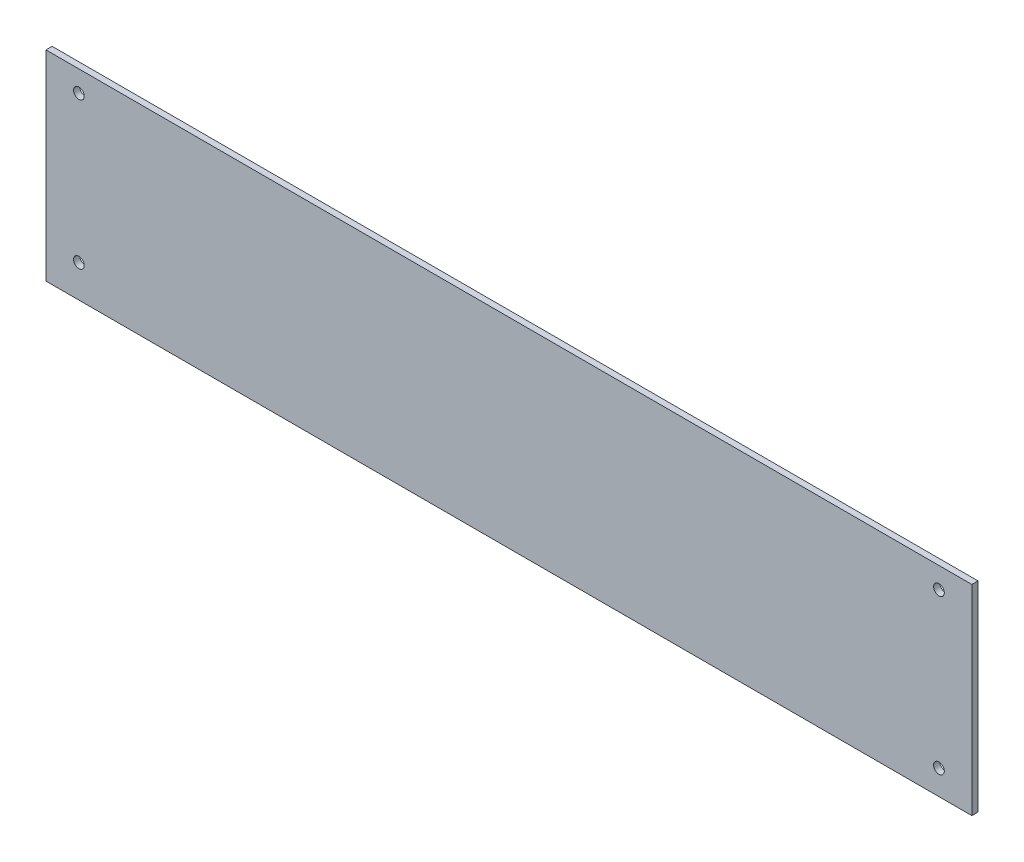
ISO-10303-21;
HEADER;
FILE_DESCRIPTION(('STEP AP214'),'2;1');
FILE_NAME('part.step','',(''),(''),'','','');
FILE_SCHEMA(('AUTOMOTIVE_DESIGN { 1 0 10303 214 1 1 1 1 }'));
ENDSEC;
DATA;
#1=APPLICATION_CONTEXT('core data for automotive mechanical design processes');
#2=APPLICATION_PROTOCOL_DEFINITION('international standard','automotive_design',2000,#1);
#3=PRODUCT_CONTEXT('',#1,'mechanical');
#4=PRODUCT('Part','Part','',(#3));
#5=PRODUCT_RELATED_PRODUCT_CATEGORY('part','',(#4));
#6=PRODUCT_DEFINITION_FORMATION('','',#4);
#7=PRODUCT_DEFINITION_CONTEXT('part definition',#1,'design');
#8=PRODUCT_DEFINITION('design','',#6,#7);
#9=PRODUCT_DEFINITION_SHAPE('','',#8);
#10=(LENGTH_UNIT() NAMED_UNIT(*) SI_UNIT(.MILLI.,.METRE.));
#11=(NAMED_UNIT(*) PLANE_ANGLE_UNIT() SI_UNIT($,.RADIAN.));
#12=(NAMED_UNIT(*) SI_UNIT($,.STERADIAN.) SOLID_ANGLE_UNIT());
#13=UNCERTAINTY_MEASURE_WITH_UNIT(LENGTH_MEASURE(1.E-05),#10,'distance_accuracy_value','');
#14=(GEOMETRIC_REPRESENTATION_CONTEXT(3) GLOBAL_UNCERTAINTY_ASSIGNED_CONTEXT((#13)) GLOBAL_UNIT_ASSIGNED_CONTEXT((#10,
#11,#12)) REPRESENTATION_CONTEXT('',''));
#15=CARTESIAN_POINT('',(0.,0.,0.));
#16=DIRECTION('',(0.,0.,1.));
#17=DIRECTION('',(1.,0.,0.));
#18=AXIS2_PLACEMENT_3D('',#15,#16,#17);
#19=CARTESIAN_POINT('',(0.,0.,3.));
#20=DIRECTION('',(-1.,0.,0.));
#21=DIRECTION('',(0.,0.,1.));
#22=AXIS2_PLACEMENT_3D('',#19,#20,#21);
#23=PLANE('',#22);
#24=DIRECTION('',(0.,1.,0.));
#25=VECTOR('',#24,1.);
#26=CARTESIAN_POINT('',(0.,0.,0.));
#27=LINE('',#26,#25);
#28=CARTESIAN_POINT('',(0.,0.,0.));
#29=VERTEX_POINT('',#28);
#30=CARTESIAN_POINT('',(0.,97.39,0.));
#31=VERTEX_POINT('',#30);
#32=EDGE_CURVE('E101',#29,#31,#27,.T.);
#33=ORIENTED_EDGE('',*,*,#32,.T.);
#34=DIRECTION('',(0.,0.,-1.));
#35=VECTOR('',#34,1.);
#36=CARTESIAN_POINT('',(0.,97.39,3.));
#37=LINE('',#36,#35);
#38=CARTESIAN_POINT('',(0.,97.39,3.));
#39=VERTEX_POINT('',#38);
#40=EDGE_CURVE('E11',#39,#31,#37,.T.);
#41=ORIENTED_EDGE('',*,*,#40,.F.);
#42=DIRECTION('',(0.,1.,0.));
#43=VECTOR('',#42,1.);
#44=CARTESIAN_POINT('',(0.,0.,3.));
#45=LINE('',#44,#43);
#46=CARTESIAN_POINT('',(0.,0.,3.));
#47=VERTEX_POINT('',#46);
#48=EDGE_CURVE('E88',#47,#39,#45,.T.);
#49=ORIENTED_EDGE('',*,*,#48,.F.);
#50=DIRECTION('',(0.,0.,-1.));
#51=VECTOR('',#50,1.);
#52=CARTESIAN_POINT('',(0.,0.,3.));
#53=LINE('',#52,#51);
#54=EDGE_CURVE('E97',#47,#29,#53,.T.);
#55=ORIENTED_EDGE('',*,*,#54,.T.);
#56=EDGE_LOOP('',(#33,#41,#49,#55));
#57=FACE_BOUND('',#56,.T.);
#58=ADVANCED_FACE('F35',(#57),#23,.F.);
#59=CARTESIAN_POINT('',(0.,97.39,3.));
#60=DIRECTION('',(0.,-1.,0.));
#61=DIRECTION('',(1.,0.,0.));
#62=AXIS2_PLACEMENT_3D('',#59,#60,#61);
#63=PLANE('',#62);
#64=DIRECTION('',(-1.,0.,0.));
#65=VECTOR('',#64,1.);
#66=CARTESIAN_POINT('',(0.,97.39,0.));
#67=LINE('',#66,#65);
#68=CARTESIAN_POINT('',(-450.3,97.39,0.));
#69=VERTEX_POINT('',#68);
#70=EDGE_CURVE('E92',#31,#69,#67,.T.);
#71=ORIENTED_EDGE('',*,*,#70,.T.);
#72=DIRECTION('',(0.,0.,-1.));
#73=VECTOR('',#72,1.);
#74=CARTESIAN_POINT('',(-450.3,97.39,3.));
#75=LINE('',#74,#73);
#76=CARTESIAN_POINT('',(-450.3,97.39,3.));
#77=VERTEX_POINT('',#76);
#78=EDGE_CURVE('E44',#77,#69,#75,.T.);
#79=ORIENTED_EDGE('',*,*,#78,.F.);
#80=DIRECTION('',(-1.,0.,0.));
#81=VECTOR('',#80,1.);
#82=CARTESIAN_POINT('',(0.,97.39,3.));
#83=LINE('',#82,#81);
#84=EDGE_CURVE('E83',#39,#77,#83,.T.);
#85=ORIENTED_EDGE('',*,*,#84,.F.);
#86=ORIENTED_EDGE('',*,*,#40,.T.);
#87=EDGE_LOOP('',(#71,#79,#85,#86));
#88=FACE_BOUND('',#87,.T.);
#89=ADVANCED_FACE('F91',(#88),#63,.F.);
#90=CARTESIAN_POINT('',(-450.3,0.,3.));
#91=DIRECTION('',(1.,0.,0.));
#92=DIRECTION('',(0.,0.,-1.));
#93=AXIS2_PLACEMENT_3D('',#90,#91,#92);
#94=PLANE('',#93);
#95=DIRECTION('',(0.,-1.,0.));
#96=VECTOR('',#95,1.);
#97=CARTESIAN_POINT('',(-450.3,0.,0.));
#98=LINE('',#97,#96);
#99=CARTESIAN_POINT('',(-450.3,0.,0.));
#100=VERTEX_POINT('',#99);
#101=EDGE_CURVE('E70',#69,#100,#98,.T.);
#102=ORIENTED_EDGE('',*,*,#101,.T.);
#103=DIRECTION('',(0.,0.,-1.));
#104=VECTOR('',#103,1.);
#105=CARTESIAN_POINT('',(-450.3,0.,3.));
#106=LINE('',#105,#104);
#107=CARTESIAN_POINT('',(-450.3,0.,3.));
#108=VERTEX_POINT('',#107);
#109=EDGE_CURVE('E93',#108,#100,#106,.T.);
#110=ORIENTED_EDGE('',*,*,#109,.F.);
#111=DIRECTION('',(0.,-1.,0.));
#112=VECTOR('',#111,1.);
#113=CARTESIAN_POINT('',(-450.3,0.,3.));
#114=LINE('',#113,#112);
#115=EDGE_CURVE('E86',#77,#108,#114,.T.);
#116=ORIENTED_EDGE('',*,*,#115,.F.);
#117=ORIENTED_EDGE('',*,*,#78,.T.);
#118=EDGE_LOOP('',(#102,#110,#116,#117));
#119=FACE_BOUND('',#118,.T.);
#120=ADVANCED_FACE('F95',(#119),#94,.F.);
#121=CARTESIAN_POINT('',(0.,0.,3.));
#122=DIRECTION('',(0.,1.,0.));
#123=DIRECTION('',(-1.,0.,0.));
#124=AXIS2_PLACEMENT_3D('',#121,#122,#123);
#125=PLANE('',#124);
#126=DIRECTION('',(1.,0.,0.));
#127=VECTOR('',#126,1.);
#128=CARTESIAN_POINT('',(0.,0.,0.));
#129=LINE('',#128,#127);
#130=EDGE_CURVE('E76',#100,#29,#129,.T.);
#131=ORIENTED_EDGE('',*,*,#130,.T.);
#132=ORIENTED_EDGE('',*,*,#54,.F.);
#133=DIRECTION('',(1.,0.,0.));
#134=VECTOR('',#133,1.);
#135=CARTESIAN_POINT('',(0.,0.,3.));
#136=LINE('',#135,#134);
#137=EDGE_CURVE('E53',#108,#47,#136,.T.);
#138=ORIENTED_EDGE('',*,*,#137,.F.);
#139=ORIENTED_EDGE('',*,*,#109,.T.);
#140=EDGE_LOOP('',(#131,#132,#138,#139));
#141=FACE_BOUND('',#140,.T.);
#142=ADVANCED_FACE('F152',(#141),#125,.F.);
#143=CARTESIAN_POINT('',(0.,0.,3.));
#144=DIRECTION('',(0.,0.,1.));
#145=DIRECTION('',(1.,0.,0.));
#146=AXIS2_PLACEMENT_3D('',#143,#144,#145);
#147=PLANE('',#146);
#148=CARTESIAN_POINT('',(-434.3,15.8505205673623,3.));
#149=DIRECTION('',(0.,0.,1.));
#150=DIRECTION('',(1.,0.,0.));
#151=AXIS2_PLACEMENT_3D('',#148,#149,#150);
#152=CIRCLE('',#151,2.60000000000002);
#153=CARTESIAN_POINT('',(-431.7,15.8505205673623,3.));
#154=VERTEX_POINT('',#153);
#155=EDGE_CURVE('E219',#154,#154,#152,.T.);
#156=ORIENTED_EDGE('',*,*,#155,.F.);
#157=EDGE_LOOP('',(#156));
#158=FACE_BOUND('',#157,.T.);
#159=CARTESIAN_POINT('',(-434.3,87.1532026944332,3.));
#160=DIRECTION('',(0.,0.,1.));
#161=DIRECTION('',(1.,0.,0.));
#162=AXIS2_PLACEMENT_3D('',#159,#160,#161);
#163=CIRCLE('',#162,2.60000000000002);
#164=CARTESIAN_POINT('',(-431.7,87.1532026944332,3.));
#165=VERTEX_POINT('',#164);
#166=EDGE_CURVE('E214',#165,#165,#163,.T.);
#167=ORIENTED_EDGE('',*,*,#166,.F.);
#168=EDGE_LOOP('',(#167));
#169=FACE_BOUND('',#168,.T.);
#170=CARTESIAN_POINT('',(-16.,87.1532026944332,3.));
#171=DIRECTION('',(0.,0.,1.));
#172=DIRECTION('',(1.,0.,0.));
#173=AXIS2_PLACEMENT_3D('',#170,#171,#172);
#174=CIRCLE('',#173,2.60000000000001);
#175=CARTESIAN_POINT('',(-13.4,87.1532026944332,3.));
#176=VERTEX_POINT('',#175);
#177=EDGE_CURVE('E207',#176,#176,#174,.T.);
#178=ORIENTED_EDGE('',*,*,#177,.F.);
#179=EDGE_LOOP('',(#178));
#180=FACE_BOUND('',#179,.T.);
#181=CARTESIAN_POINT('',(-16.,12.0246880764786,3.));
#182=DIRECTION('',(0.,0.,1.));
#183=DIRECTION('',(1.,0.,0.));
#184=AXIS2_PLACEMENT_3D('',#181,#182,#183);
#185=CIRCLE('',#184,2.59999999999999);
#186=CARTESIAN_POINT('',(-13.4,12.0246880764786,3.));
#187=VERTEX_POINT('',#186);
#188=EDGE_CURVE('E113',#187,#187,#185,.T.);
#189=ORIENTED_EDGE('',*,*,#188,.F.);
#190=EDGE_LOOP('',(#189));
#191=FACE_BOUND('',#190,.T.);
#192=ORIENTED_EDGE('',*,*,#48,.T.);
#193=ORIENTED_EDGE('',*,*,#84,.T.);
#194=ORIENTED_EDGE('',*,*,#115,.T.);
#195=ORIENTED_EDGE('',*,*,#137,.T.);
#196=EDGE_LOOP('',(#192,#193,#194,#195));
#197=FACE_BOUND('',#196,.T.);
#198=ADVANCED_FACE('F84',(#158,#169,#180,#191,#197),#147,.T.);
#199=CARTESIAN_POINT('',(0.,0.,0.));
#200=DIRECTION('',(0.,0.,1.));
#201=DIRECTION('',(1.,0.,0.));
#202=AXIS2_PLACEMENT_3D('',#199,#200,#201);
#203=PLANE('',#202);
#204=CARTESIAN_POINT('',(-434.3,15.8505205673623,0.));
#205=DIRECTION('',(0.,0.,1.));
#206=DIRECTION('',(1.,0.,0.));
#207=AXIS2_PLACEMENT_3D('',#204,#205,#206);
#208=CIRCLE('',#207,2.60000000000002);
#209=CARTESIAN_POINT('',(-431.7,15.8505205673623,0.));
#210=VERTEX_POINT('',#209);
#211=EDGE_CURVE('E38',#210,#210,#208,.T.);
#212=ORIENTED_EDGE('',*,*,#211,.T.);
#213=EDGE_LOOP('',(#212));
#214=FACE_BOUND('',#213,.T.);
#215=CARTESIAN_POINT('',(-434.3,87.1532026944332,0.));
#216=DIRECTION('',(0.,0.,1.));
#217=DIRECTION('',(1.,0.,0.));
#218=AXIS2_PLACEMENT_3D('',#215,#216,#217);
#219=CIRCLE('',#218,2.60000000000002);
#220=CARTESIAN_POINT('',(-431.7,87.1532026944332,0.));
#221=VERTEX_POINT('',#220);
#222=EDGE_CURVE('E115',#221,#221,#219,.T.);
#223=ORIENTED_EDGE('',*,*,#222,.T.);
#224=EDGE_LOOP('',(#223));
#225=FACE_BOUND('',#224,.T.);
#226=CARTESIAN_POINT('',(-16.,87.1532026944332,0.));
#227=DIRECTION('',(0.,0.,1.));
#228=DIRECTION('',(1.,0.,0.));
#229=AXIS2_PLACEMENT_3D('',#226,#227,#228);
#230=CIRCLE('',#229,2.60000000000001);
#231=CARTESIAN_POINT('',(-13.4,87.1532026944332,0.));
#232=VERTEX_POINT('',#231);
#233=EDGE_CURVE('E112',#232,#232,#230,.T.);
#234=ORIENTED_EDGE('',*,*,#233,.T.);
#235=EDGE_LOOP('',(#234));
#236=FACE_BOUND('',#235,.T.);
#237=CARTESIAN_POINT('',(-16.,12.0246880764786,0.));
#238=DIRECTION('',(0.,0.,1.));
#239=DIRECTION('',(1.,0.,0.));
#240=AXIS2_PLACEMENT_3D('',#237,#238,#239);
#241=CIRCLE('',#240,2.59999999999999);
#242=CARTESIAN_POINT('',(-13.4,12.0246880764786,0.));
#243=VERTEX_POINT('',#242);
#244=EDGE_CURVE('E109',#243,#243,#241,.T.);
#245=ORIENTED_EDGE('',*,*,#244,.T.);
#246=EDGE_LOOP('',(#245));
#247=FACE_BOUND('',#246,.T.);
#248=ORIENTED_EDGE('',*,*,#32,.F.);
#249=ORIENTED_EDGE('',*,*,#130,.F.);
#250=ORIENTED_EDGE('',*,*,#101,.F.);
#251=ORIENTED_EDGE('',*,*,#70,.F.);
#252=EDGE_LOOP('',(#248,#249,#250,#251));
#253=FACE_BOUND('',#252,.T.);
#254=ADVANCED_FACE('F122',(#214,#225,#236,#247,#253),#203,.F.);
#255=CARTESIAN_POINT('',(-16.,12.0246880764786,-17.));
#256=DIRECTION('',(0.,0.,1.));
#257=DIRECTION('',(1.,0.,0.));
#258=AXIS2_PLACEMENT_3D('',#255,#256,#257);
#259=CYLINDRICAL_SURFACE('',#258,2.59999999999999);
#260=ORIENTED_EDGE('',*,*,#188,.T.);
#261=EDGE_LOOP('',(#260));
#262=FACE_BOUND('',#261,.T.);
#263=ORIENTED_EDGE('',*,*,#244,.F.);
#264=EDGE_LOOP('',(#263));
#265=FACE_BOUND('',#264,.T.);
#266=ADVANCED_FACE('F145',(#262,#265),#259,.F.);
#267=CARTESIAN_POINT('',(-16.,87.1532026944332,-17.));
#268=DIRECTION('',(0.,0.,1.));
#269=DIRECTION('',(1.,0.,0.));
#270=AXIS2_PLACEMENT_3D('',#267,#268,#269);
#271=CYLINDRICAL_SURFACE('',#270,2.60000000000001);
#272=ORIENTED_EDGE('',*,*,#177,.T.);
#273=EDGE_LOOP('',(#272));
#274=FACE_BOUND('',#273,.T.);
#275=ORIENTED_EDGE('',*,*,#233,.F.);
#276=EDGE_LOOP('',(#275));
#277=FACE_BOUND('',#276,.T.);
#278=ADVANCED_FACE('F132',(#274,#277),#271,.F.);
#279=CARTESIAN_POINT('',(-434.3,87.1532026944332,-17.));
#280=DIRECTION('',(0.,0.,1.));
#281=DIRECTION('',(1.,0.,0.));
#282=AXIS2_PLACEMENT_3D('',#279,#280,#281);
#283=CYLINDRICAL_SURFACE('',#282,2.60000000000002);
#284=ORIENTED_EDGE('',*,*,#166,.T.);
#285=EDGE_LOOP('',(#284));
#286=FACE_BOUND('',#285,.T.);
#287=ORIENTED_EDGE('',*,*,#222,.F.);
#288=EDGE_LOOP('',(#287));
#289=FACE_BOUND('',#288,.T.);
#290=ADVANCED_FACE('F126',(#286,#289),#283,.F.);
#291=CARTESIAN_POINT('',(-434.3,15.8505205673623,-17.));
#292=DIRECTION('',(0.,0.,1.));
#293=DIRECTION('',(1.,0.,0.));
#294=AXIS2_PLACEMENT_3D('',#291,#292,#293);
#295=CYLINDRICAL_SURFACE('',#294,2.60000000000002);
#296=ORIENTED_EDGE('',*,*,#155,.T.);
#297=EDGE_LOOP('',(#296));
#298=FACE_BOUND('',#297,.T.);
#299=ORIENTED_EDGE('',*,*,#211,.F.);
#300=EDGE_LOOP('',(#299));
#301=FACE_BOUND('',#300,.T.);
#302=ADVANCED_FACE('F124',(#298,#301),#295,.F.);
#303=CLOSED_SHELL('',(#58,#89,#120,#142,#198,#254,#266,#278,#290,#302));
#304=MANIFOLD_SOLID_BREP('B2',#303);
#305=ADVANCED_BREP_SHAPE_REPRESENTATION('',(#18,#304),#14);
#306=SHAPE_DEFINITION_REPRESENTATION(#9,#305);
ENDSEC;
END-ISO-10303-21;
